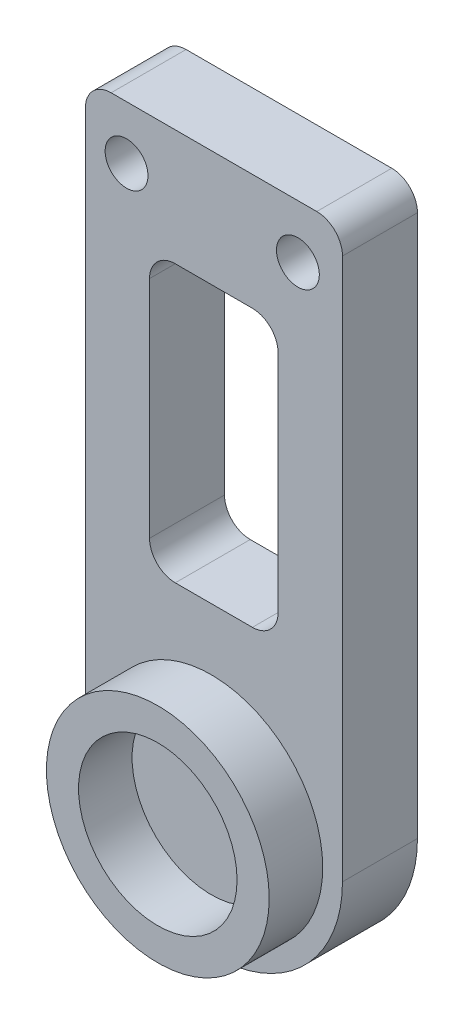
ISO-10303-21;
HEADER;
FILE_DESCRIPTION(('STEP AP214'),'2;1');
FILE_NAME('part.step','',(''),(''),'','','');
FILE_SCHEMA(('AUTOMOTIVE_DESIGN { 1 0 10303 214 1 1 1 1 }'));
ENDSEC;
DATA;
#1=APPLICATION_CONTEXT('core data for automotive mechanical design processes');
#2=APPLICATION_PROTOCOL_DEFINITION('international standard','automotive_design',2000,#1);
#3=PRODUCT_CONTEXT('',#1,'mechanical');
#4=PRODUCT('Part','Part','',(#3));
#5=PRODUCT_RELATED_PRODUCT_CATEGORY('part','',(#4));
#6=PRODUCT_DEFINITION_FORMATION('','',#4);
#7=PRODUCT_DEFINITION_CONTEXT('part definition',#1,'design');
#8=PRODUCT_DEFINITION('design','',#6,#7);
#9=PRODUCT_DEFINITION_SHAPE('','',#8);
#10=(LENGTH_UNIT() NAMED_UNIT(*) SI_UNIT(.MILLI.,.METRE.));
#11=(NAMED_UNIT(*) PLANE_ANGLE_UNIT() SI_UNIT($,.RADIAN.));
#12=(NAMED_UNIT(*) SI_UNIT($,.STERADIAN.) SOLID_ANGLE_UNIT());
#13=UNCERTAINTY_MEASURE_WITH_UNIT(LENGTH_MEASURE(1.E-05),#10,'distance_accuracy_value','');
#14=(GEOMETRIC_REPRESENTATION_CONTEXT(3) GLOBAL_UNCERTAINTY_ASSIGNED_CONTEXT((#13)) GLOBAL_UNIT_ASSIGNED_CONTEXT((#10,
#11,#12)) REPRESENTATION_CONTEXT('',''));
#15=CARTESIAN_POINT('',(0.,0.,0.));
#16=DIRECTION('',(0.,0.,1.));
#17=DIRECTION('',(1.,0.,0.));
#18=AXIS2_PLACEMENT_3D('',#15,#16,#17);
#19=CARTESIAN_POINT('',(0.,0.,13.5));
#20=DIRECTION('',(0.,0.,1.));
#21=DIRECTION('',(1.,0.,0.));
#22=AXIS2_PLACEMENT_3D('',#19,#20,#21);
#23=PLANE('',#22);
#24=CARTESIAN_POINT('',(-277.110164076838,256.963992390388,13.5));
#25=DIRECTION('',(0.,0.,1.));
#26=DIRECTION('',(1.,0.,0.));
#27=AXIS2_PLACEMENT_3D('',#24,#25,#26);
#28=CIRCLE('',#27,5.20000000000003);
#29=CARTESIAN_POINT('',(-271.910164076838,256.963992390388,13.5));
#30=VERTEX_POINT('',#29);
#31=EDGE_CURVE('E276',#30,#30,#28,.T.);
#32=ORIENTED_EDGE('',*,*,#31,.F.);
#33=EDGE_LOOP('',(#32));
#34=FACE_BOUND('',#33,.T.);
#35=CARTESIAN_POINT('',(-281.069234981742,280.854420412727,13.5));
#36=DIRECTION('',(0.,0.,1.));
#37=DIRECTION('',(1.,0.,0.));
#38=AXIS2_PLACEMENT_3D('',#35,#36,#37);
#39=CIRCLE('',#38,1.00000000000005);
#40=CARTESIAN_POINT('',(-280.069234981742,280.854420412727,13.5));
#41=VERTEX_POINT('',#40);
#42=EDGE_CURVE('E319',#41,#41,#39,.T.);
#43=ORIENTED_EDGE('',*,*,#42,.F.);
#44=EDGE_LOOP('',(#43));
#45=FACE_BOUND('',#44,.T.);
#46=DIRECTION('',(0.,-1.,0.));
#47=VECTOR('',#46,1.);
#48=CARTESIAN_POINT('',(-282.988860295457,283.351135253906,13.5));
#49=LINE('',#48,#47);
#50=CARTESIAN_POINT('',(-282.988860295457,282.151135253906,13.5));
#51=VERTEX_POINT('',#50);
#52=CARTESIAN_POINT('',(-282.988860295457,256.851135253906,13.5));
#53=VERTEX_POINT('',#52);
#54=EDGE_CURVE('E327',#51,#53,#49,.T.);
#55=ORIENTED_EDGE('',*,*,#54,.T.);
#56=CARTESIAN_POINT('',(-276.988860295457,256.851135253906,13.5));
#57=DIRECTION('',(0.,0.,1.));
#58=DIRECTION('',(1.,0.,0.));
#59=AXIS2_PLACEMENT_3D('',#56,#57,#58);
#60=CIRCLE('',#59,6.);
#61=CARTESIAN_POINT('',(-276.988860295457,250.851135253906,13.5));
#62=VERTEX_POINT('',#61);
#63=EDGE_CURVE('E60',#53,#62,#60,.T.);
#64=ORIENTED_EDGE('',*,*,#63,.T.);
#65=CARTESIAN_POINT('',(-276.988860295457,256.851135253906,13.5));
#66=DIRECTION('',(0.,0.,1.));
#67=DIRECTION('',(1.,0.,0.));
#68=AXIS2_PLACEMENT_3D('',#65,#66,#67);
#69=CIRCLE('',#68,6.);
#70=CARTESIAN_POINT('',(-270.988860295457,256.851135253906,13.5));
#71=VERTEX_POINT('',#70);
#72=EDGE_CURVE('E55',#62,#71,#69,.T.);
#73=ORIENTED_EDGE('',*,*,#72,.T.);
#74=DIRECTION('',(0.,1.,0.));
#75=VECTOR('',#74,1.);
#76=CARTESIAN_POINT('',(-270.988860295457,283.351135253906,13.5));
#77=LINE('',#76,#75);
#78=CARTESIAN_POINT('',(-270.988860295457,282.151135253906,13.5));
#79=VERTEX_POINT('',#78);
#80=EDGE_CURVE('E181',#71,#79,#77,.T.);
#81=ORIENTED_EDGE('',*,*,#80,.T.);
#82=CARTESIAN_POINT('',(-272.188860295457,282.151135253906,13.5));
#83=DIRECTION('',(0.,0.,1.));
#84=DIRECTION('',(1.,0.,0.));
#85=AXIS2_PLACEMENT_3D('',#82,#83,#84);
#86=CIRCLE('',#85,1.2);
#87=CARTESIAN_POINT('',(-272.188860295457,283.351135253906,13.5));
#88=VERTEX_POINT('',#87);
#89=EDGE_CURVE('E224',#79,#88,#86,.T.);
#90=ORIENTED_EDGE('',*,*,#89,.T.);
#91=DIRECTION('',(-1.,0.,0.));
#92=VECTOR('',#91,1.);
#93=CARTESIAN_POINT('',(-282.988860295457,283.351135253906,13.5));
#94=LINE('',#93,#92);
#95=CARTESIAN_POINT('',(-281.788860295457,283.351135253906,13.5));
#96=VERTEX_POINT('',#95);
#97=EDGE_CURVE('E174',#88,#96,#94,.T.);
#98=ORIENTED_EDGE('',*,*,#97,.T.);
#99=CARTESIAN_POINT('',(-281.788860295457,282.151135253906,13.5));
#100=DIRECTION('',(0.,0.,1.));
#101=DIRECTION('',(1.,0.,0.));
#102=AXIS2_PLACEMENT_3D('',#99,#100,#101);
#103=CIRCLE('',#102,1.2);
#104=EDGE_CURVE('E227',#96,#51,#103,.T.);
#105=ORIENTED_EDGE('',*,*,#104,.T.);
#106=EDGE_LOOP('',(#55,#64,#73,#81,#90,#98,#105));
#107=FACE_BOUND('',#106,.T.);
#108=CARTESIAN_POINT('',(-273.069234981742,280.854420412727,13.5));
#109=DIRECTION('',(0.,0.,1.));
#110=DIRECTION('',(1.,0.,0.));
#111=AXIS2_PLACEMENT_3D('',#108,#109,#110);
#112=CIRCLE('',#111,0.999999999999998);
#113=CARTESIAN_POINT('',(-272.069234981742,280.854420412727,13.5));
#114=VERTEX_POINT('',#113);
#115=EDGE_CURVE('E311',#114,#114,#112,.T.);
#116=ORIENTED_EDGE('',*,*,#115,.F.);
#117=EDGE_LOOP('',(#116));
#118=FACE_BOUND('',#117,.T.);
#119=DIRECTION('',(1.,0.,0.));
#120=VECTOR('',#119,1.);
#121=CARTESIAN_POINT('',(-279.994472891922,265.037209026072,13.5));
#122=LINE('',#121,#120);
#123=CARTESIAN_POINT('',(-278.794472891922,265.037209026072,13.5));
#124=VERTEX_POINT('',#123);
#125=CARTESIAN_POINT('',(-275.194472891922,265.037209026072,13.5));
#126=VERTEX_POINT('',#125);
#127=EDGE_CURVE('E289',#124,#126,#122,.T.);
#128=ORIENTED_EDGE('',*,*,#127,.F.);
#129=CARTESIAN_POINT('',(-278.794472891922,266.237209026072,13.5));
#130=DIRECTION('',(0.,0.,1.));
#131=DIRECTION('',(1.,0.,0.));
#132=AXIS2_PLACEMENT_3D('',#129,#130,#131);
#133=CIRCLE('',#132,1.2);
#134=CARTESIAN_POINT('',(-279.994472891922,266.237209026072,13.5));
#135=VERTEX_POINT('',#134);
#136=EDGE_CURVE('E237',#124,#135,#133,.F.);
#137=ORIENTED_EDGE('',*,*,#136,.T.);
#138=DIRECTION('',(0.,-1.,0.));
#139=VECTOR('',#138,1.);
#140=CARTESIAN_POINT('',(-279.994472891922,277.937209026072,13.5));
#141=LINE('',#140,#139);
#142=CARTESIAN_POINT('',(-279.994472891922,276.737209026072,13.5));
#143=VERTEX_POINT('',#142);
#144=EDGE_CURVE('E286',#143,#135,#141,.T.);
#145=ORIENTED_EDGE('',*,*,#144,.F.);
#146=CARTESIAN_POINT('',(-278.794472891922,276.737209026072,13.5));
#147=DIRECTION('',(0.,0.,1.));
#148=DIRECTION('',(1.,0.,0.));
#149=AXIS2_PLACEMENT_3D('',#146,#147,#148);
#150=CIRCLE('',#149,1.2);
#151=CARTESIAN_POINT('',(-278.794472891922,277.937209026072,13.5));
#152=VERTEX_POINT('',#151);
#153=EDGE_CURVE('E156',#143,#152,#150,.F.);
#154=ORIENTED_EDGE('',*,*,#153,.T.);
#155=DIRECTION('',(-1.,0.,0.));
#156=VECTOR('',#155,1.);
#157=CARTESIAN_POINT('',(-279.994472891922,277.937209026072,13.5));
#158=LINE('',#157,#156);
#159=CARTESIAN_POINT('',(-275.194472891922,277.937209026072,13.5));
#160=VERTEX_POINT('',#159);
#161=EDGE_CURVE('E297',#160,#152,#158,.T.);
#162=ORIENTED_EDGE('',*,*,#161,.F.);
#163=CARTESIAN_POINT('',(-275.194472891922,276.737209026072,13.5));
#164=DIRECTION('',(0.,0.,1.));
#165=DIRECTION('',(1.,0.,0.));
#166=AXIS2_PLACEMENT_3D('',#163,#164,#165);
#167=CIRCLE('',#166,1.2);
#168=CARTESIAN_POINT('',(-273.994472891922,276.737209026072,13.5));
#169=VERTEX_POINT('',#168);
#170=EDGE_CURVE('E157',#160,#169,#167,.F.);
#171=ORIENTED_EDGE('',*,*,#170,.T.);
#172=DIRECTION('',(0.,1.,0.));
#173=VECTOR('',#172,1.);
#174=CARTESIAN_POINT('',(-273.994472891922,277.937209026072,13.5));
#175=LINE('',#174,#173);
#176=CARTESIAN_POINT('',(-273.994472891922,266.237209026072,13.5));
#177=VERTEX_POINT('',#176);
#178=EDGE_CURVE('E293',#177,#169,#175,.T.);
#179=ORIENTED_EDGE('',*,*,#178,.F.);
#180=CARTESIAN_POINT('',(-275.194472891922,266.237209026072,13.5));
#181=DIRECTION('',(0.,0.,1.));
#182=DIRECTION('',(1.,0.,0.));
#183=AXIS2_PLACEMENT_3D('',#180,#181,#182);
#184=CIRCLE('',#183,1.2);
#185=EDGE_CURVE('E243',#177,#126,#184,.F.);
#186=ORIENTED_EDGE('',*,*,#185,.T.);
#187=EDGE_LOOP('',(#128,#137,#145,#154,#162,#171,#179,#186));
#188=FACE_BOUND('',#187,.T.);
#189=ADVANCED_FACE('F39',(#34,#45,#107,#118,#188),#23,.T.);
#190=CARTESIAN_POINT('',(0.,0.,10.));
#191=DIRECTION('',(0.,0.,1.));
#192=DIRECTION('',(1.,0.,0.));
#193=AXIS2_PLACEMENT_3D('',#190,#191,#192);
#194=PLANE('',#193);
#195=CARTESIAN_POINT('',(-273.069234981742,280.854420412727,10.));
#196=DIRECTION('',(0.,0.,1.));
#197=DIRECTION('',(1.,0.,0.));
#198=AXIS2_PLACEMENT_3D('',#195,#196,#197);
#199=CIRCLE('',#198,0.999999999999998);
#200=CARTESIAN_POINT('',(-272.069234981742,280.854420412727,10.));
#201=VERTEX_POINT('',#200);
#202=EDGE_CURVE('E300',#201,#201,#199,.T.);
#203=ORIENTED_EDGE('',*,*,#202,.T.);
#204=EDGE_LOOP('',(#203));
#205=FACE_BOUND('',#204,.T.);
#206=CARTESIAN_POINT('',(-281.069234981742,280.854420412727,10.));
#207=DIRECTION('',(0.,0.,1.));
#208=DIRECTION('',(1.,0.,0.));
#209=AXIS2_PLACEMENT_3D('',#206,#207,#208);
#210=CIRCLE('',#209,1.00000000000005);
#211=CARTESIAN_POINT('',(-280.069234981742,280.854420412727,10.));
#212=VERTEX_POINT('',#211);
#213=EDGE_CURVE('E315',#212,#212,#210,.T.);
#214=ORIENTED_EDGE('',*,*,#213,.T.);
#215=EDGE_LOOP('',(#214));
#216=FACE_BOUND('',#215,.T.);
#217=CARTESIAN_POINT('',(-276.988860295457,256.851135253906,10.));
#218=DIRECTION('',(0.,0.,1.));
#219=DIRECTION('',(1.,0.,0.));
#220=AXIS2_PLACEMENT_3D('',#217,#218,#219);
#221=CIRCLE('',#220,6.);
#222=CARTESIAN_POINT('',(-270.988860295457,256.851135253906,10.));
#223=VERTEX_POINT('',#222);
#224=CARTESIAN_POINT('',(-276.988860295457,250.851135253906,10.));
#225=VERTEX_POINT('',#224);
#226=EDGE_CURVE('E253',#223,#225,#221,.F.);
#227=ORIENTED_EDGE('',*,*,#226,.T.);
#228=CARTESIAN_POINT('',(-276.988860295457,256.851135253906,10.));
#229=DIRECTION('',(0.,0.,1.));
#230=DIRECTION('',(1.,0.,0.));
#231=AXIS2_PLACEMENT_3D('',#228,#229,#230);
#232=CIRCLE('',#231,6.);
#233=CARTESIAN_POINT('',(-282.988860295457,256.851135253906,10.));
#234=VERTEX_POINT('',#233);
#235=EDGE_CURVE('E256',#225,#234,#232,.F.);
#236=ORIENTED_EDGE('',*,*,#235,.T.);
#237=DIRECTION('',(0.,-1.,0.));
#238=VECTOR('',#237,1.);
#239=CARTESIAN_POINT('',(-282.988860295457,283.351135253906,10.));
#240=LINE('',#239,#238);
#241=CARTESIAN_POINT('',(-282.988860295457,282.151135253906,10.));
#242=VERTEX_POINT('',#241);
#243=EDGE_CURVE('E323',#242,#234,#240,.T.);
#244=ORIENTED_EDGE('',*,*,#243,.F.);
#245=CARTESIAN_POINT('',(-281.788860295457,282.151135253906,10.));
#246=DIRECTION('',(0.,0.,1.));
#247=DIRECTION('',(1.,0.,0.));
#248=AXIS2_PLACEMENT_3D('',#245,#246,#247);
#249=CIRCLE('',#248,1.2);
#250=CARTESIAN_POINT('',(-281.788860295457,283.351135253906,10.));
#251=VERTEX_POINT('',#250);
#252=EDGE_CURVE('E214',#242,#251,#249,.F.);
#253=ORIENTED_EDGE('',*,*,#252,.T.);
#254=DIRECTION('',(-1.,0.,0.));
#255=VECTOR('',#254,1.);
#256=CARTESIAN_POINT('',(-282.988860295457,283.351135253906,10.));
#257=LINE('',#256,#255);
#258=CARTESIAN_POINT('',(-272.188860295457,283.351135253906,10.));
#259=VERTEX_POINT('',#258);
#260=EDGE_CURVE('E184',#259,#251,#257,.T.);
#261=ORIENTED_EDGE('',*,*,#260,.F.);
#262=CARTESIAN_POINT('',(-272.188860295457,282.151135253906,10.));
#263=DIRECTION('',(0.,0.,1.));
#264=DIRECTION('',(1.,0.,0.));
#265=AXIS2_PLACEMENT_3D('',#262,#263,#264);
#266=CIRCLE('',#265,1.2);
#267=CARTESIAN_POINT('',(-270.988860295457,282.151135253906,10.));
#268=VERTEX_POINT('',#267);
#269=EDGE_CURVE('E210',#259,#268,#266,.F.);
#270=ORIENTED_EDGE('',*,*,#269,.T.);
#271=DIRECTION('',(0.,1.,0.));
#272=VECTOR('',#271,1.);
#273=CARTESIAN_POINT('',(-270.988860295457,283.351135253906,10.));
#274=LINE('',#273,#272);
#275=EDGE_CURVE('E334',#223,#268,#274,.T.);
#276=ORIENTED_EDGE('',*,*,#275,.F.);
#277=EDGE_LOOP('',(#227,#236,#244,#253,#261,#270,#276));
#278=FACE_BOUND('',#277,.T.);
#279=DIRECTION('',(-1.,0.,0.));
#280=VECTOR('',#279,1.);
#281=CARTESIAN_POINT('',(-279.994472891922,277.937209026072,10.));
#282=LINE('',#281,#280);
#283=CARTESIAN_POINT('',(-275.194472891922,277.937209026072,10.));
#284=VERTEX_POINT('',#283);
#285=CARTESIAN_POINT('',(-278.794472891922,277.937209026072,10.));
#286=VERTEX_POINT('',#285);
#287=EDGE_CURVE('E150',#284,#286,#282,.T.);
#288=ORIENTED_EDGE('',*,*,#287,.T.);
#289=CARTESIAN_POINT('',(-278.794472891922,276.737209026072,10.));
#290=DIRECTION('',(0.,0.,1.));
#291=DIRECTION('',(1.,0.,0.));
#292=AXIS2_PLACEMENT_3D('',#289,#290,#291);
#293=CIRCLE('',#292,1.2);
#294=CARTESIAN_POINT('',(-279.994472891922,276.737209026072,10.));
#295=VERTEX_POINT('',#294);
#296=EDGE_CURVE('E145',#286,#295,#293,.T.);
#297=ORIENTED_EDGE('',*,*,#296,.T.);
#298=DIRECTION('',(0.,-1.,0.));
#299=VECTOR('',#298,1.);
#300=CARTESIAN_POINT('',(-279.994472891922,277.937209026072,10.));
#301=LINE('',#300,#299);
#302=CARTESIAN_POINT('',(-279.994472891922,266.237209026072,10.));
#303=VERTEX_POINT('',#302);
#304=EDGE_CURVE('E148',#295,#303,#301,.T.);
#305=ORIENTED_EDGE('',*,*,#304,.T.);
#306=CARTESIAN_POINT('',(-278.794472891922,266.237209026072,10.));
#307=DIRECTION('',(0.,0.,1.));
#308=DIRECTION('',(1.,0.,0.));
#309=AXIS2_PLACEMENT_3D('',#306,#307,#308);
#310=CIRCLE('',#309,1.2);
#311=CARTESIAN_POINT('',(-278.794472891922,265.037209026072,10.));
#312=VERTEX_POINT('',#311);
#313=EDGE_CURVE('E234',#303,#312,#310,.T.);
#314=ORIENTED_EDGE('',*,*,#313,.T.);
#315=DIRECTION('',(1.,0.,0.));
#316=VECTOR('',#315,1.);
#317=CARTESIAN_POINT('',(-279.994472891922,265.037209026072,10.));
#318=LINE('',#317,#316);
#319=CARTESIAN_POINT('',(-275.194472891922,265.037209026072,10.));
#320=VERTEX_POINT('',#319);
#321=EDGE_CURVE('E168',#312,#320,#318,.T.);
#322=ORIENTED_EDGE('',*,*,#321,.T.);
#323=CARTESIAN_POINT('',(-275.194472891922,266.237209026072,10.));
#324=DIRECTION('',(0.,0.,1.));
#325=DIRECTION('',(1.,0.,0.));
#326=AXIS2_PLACEMENT_3D('',#323,#324,#325);
#327=CIRCLE('',#326,1.2);
#328=CARTESIAN_POINT('',(-273.994472891922,266.237209026072,10.));
#329=VERTEX_POINT('',#328);
#330=EDGE_CURVE('E240',#320,#329,#327,.T.);
#331=ORIENTED_EDGE('',*,*,#330,.T.);
#332=DIRECTION('',(0.,1.,0.));
#333=VECTOR('',#332,1.);
#334=CARTESIAN_POINT('',(-273.994472891922,277.937209026072,10.));
#335=LINE('',#334,#333);
#336=CARTESIAN_POINT('',(-273.994472891922,276.737209026072,10.));
#337=VERTEX_POINT('',#336);
#338=EDGE_CURVE('E305',#329,#337,#335,.T.);
#339=ORIENTED_EDGE('',*,*,#338,.T.);
#340=CARTESIAN_POINT('',(-275.194472891922,276.737209026072,10.));
#341=DIRECTION('',(0.,0.,1.));
#342=DIRECTION('',(1.,0.,0.));
#343=AXIS2_PLACEMENT_3D('',#340,#341,#342);
#344=CIRCLE('',#343,1.2);
#345=EDGE_CURVE('E246',#337,#284,#344,.T.);
#346=ORIENTED_EDGE('',*,*,#345,.T.);
#347=EDGE_LOOP('',(#288,#297,#305,#314,#322,#331,#339,#346));
#348=FACE_BOUND('',#347,.T.);
#349=ADVANCED_FACE('F147',(#205,#216,#278,#348),#194,.F.);
#350=CARTESIAN_POINT('',(-282.988860295457,283.351135253906,13.5));
#351=DIRECTION('',(1.,0.,0.));
#352=DIRECTION('',(0.,0.,-1.));
#353=AXIS2_PLACEMENT_3D('',#350,#351,#352);
#354=PLANE('',#353);
#355=ORIENTED_EDGE('',*,*,#243,.T.);
#356=DIRECTION('',(0.,0.,-1.));
#357=VECTOR('',#356,1.);
#358=CARTESIAN_POINT('',(-282.988860295457,256.851135253906,13.5));
#359=LINE('',#358,#357);
#360=EDGE_CURVE('E259',#234,#53,#359,.F.);
#361=ORIENTED_EDGE('',*,*,#360,.T.);
#362=ORIENTED_EDGE('',*,*,#54,.F.);
#363=DIRECTION('',(0.,0.,-1.));
#364=VECTOR('',#363,1.);
#365=CARTESIAN_POINT('',(-282.988860295457,282.151135253906,13.5));
#366=LINE('',#365,#364);
#367=EDGE_CURVE('E206',#51,#242,#366,.T.);
#368=ORIENTED_EDGE('',*,*,#367,.T.);
#369=EDGE_LOOP('',(#355,#361,#362,#368));
#370=FACE_BOUND('',#369,.T.);
#371=ADVANCED_FACE('F354',(#370),#354,.F.);
#372=CARTESIAN_POINT('',(-270.988860295457,283.351135253906,13.5));
#373=DIRECTION('',(-1.,0.,0.));
#374=DIRECTION('',(0.,0.,1.));
#375=AXIS2_PLACEMENT_3D('',#372,#373,#374);
#376=PLANE('',#375);
#377=ORIENTED_EDGE('',*,*,#80,.F.);
#378=DIRECTION('',(0.,0.,-1.));
#379=VECTOR('',#378,1.);
#380=CARTESIAN_POINT('',(-270.988860295457,256.851135253906,13.5));
#381=LINE('',#380,#379);
#382=EDGE_CURVE('E48',#71,#223,#381,.T.);
#383=ORIENTED_EDGE('',*,*,#382,.T.);
#384=ORIENTED_EDGE('',*,*,#275,.T.);
#385=DIRECTION('',(0.,0.,-1.));
#386=VECTOR('',#385,1.);
#387=CARTESIAN_POINT('',(-270.988860295457,282.151135253906,13.5));
#388=LINE('',#387,#386);
#389=EDGE_CURVE('E230',#268,#79,#388,.F.);
#390=ORIENTED_EDGE('',*,*,#389,.T.);
#391=EDGE_LOOP('',(#377,#383,#384,#390));
#392=FACE_BOUND('',#391,.T.);
#393=ADVANCED_FACE('F361',(#392),#376,.F.);
#394=CARTESIAN_POINT('',(-282.988860295457,283.351135253906,13.5));
#395=DIRECTION('',(0.,-1.,0.));
#396=DIRECTION('',(1.,0.,0.));
#397=AXIS2_PLACEMENT_3D('',#394,#395,#396);
#398=PLANE('',#397);
#399=ORIENTED_EDGE('',*,*,#260,.T.);
#400=DIRECTION('',(0.,0.,-1.));
#401=VECTOR('',#400,1.);
#402=CARTESIAN_POINT('',(-281.788860295457,283.351135253906,13.5));
#403=LINE('',#402,#401);
#404=EDGE_CURVE('E221',#251,#96,#403,.F.);
#405=ORIENTED_EDGE('',*,*,#404,.T.);
#406=ORIENTED_EDGE('',*,*,#97,.F.);
#407=DIRECTION('',(0.,0.,-1.));
#408=VECTOR('',#407,1.);
#409=CARTESIAN_POINT('',(-272.188860295457,283.351135253906,13.5));
#410=LINE('',#409,#408);
#411=EDGE_CURVE('E217',#88,#259,#410,.T.);
#412=ORIENTED_EDGE('',*,*,#411,.T.);
#413=EDGE_LOOP('',(#399,#405,#406,#412));
#414=FACE_BOUND('',#413,.T.);
#415=ADVANCED_FACE('F343',(#414),#398,.F.);
#416=CARTESIAN_POINT('',(-281.069234981742,280.854420412727,13.5));
#417=DIRECTION('',(0.,0.,-1.));
#418=DIRECTION('',(-1.,0.,0.));
#419=AXIS2_PLACEMENT_3D('',#416,#417,#418);
#420=CYLINDRICAL_SURFACE('',#419,1.00000000000005);
#421=ORIENTED_EDGE('',*,*,#42,.T.);
#422=EDGE_LOOP('',(#421));
#423=FACE_BOUND('',#422,.T.);
#424=ORIENTED_EDGE('',*,*,#213,.F.);
#425=EDGE_LOOP('',(#424));
#426=FACE_BOUND('',#425,.T.);
#427=ADVANCED_FACE('F423',(#423,#426),#420,.F.);
#428=CARTESIAN_POINT('',(-273.069234981742,280.854420412727,13.5));
#429=DIRECTION('',(0.,0.,-1.));
#430=DIRECTION('',(-1.,0.,0.));
#431=AXIS2_PLACEMENT_3D('',#428,#429,#430);
#432=CYLINDRICAL_SURFACE('',#431,0.999999999999998);
#433=ORIENTED_EDGE('',*,*,#115,.T.);
#434=EDGE_LOOP('',(#433));
#435=FACE_BOUND('',#434,.T.);
#436=ORIENTED_EDGE('',*,*,#202,.F.);
#437=EDGE_LOOP('',(#436));
#438=FACE_BOUND('',#437,.T.);
#439=ADVANCED_FACE('F421',(#435,#438),#432,.F.);
#440=CARTESIAN_POINT('',(-279.994472891922,277.937209026072,13.5));
#441=DIRECTION('',(1.,0.,0.));
#442=DIRECTION('',(0.,0.,-1.));
#443=AXIS2_PLACEMENT_3D('',#440,#441,#442);
#444=PLANE('',#443);
#445=ORIENTED_EDGE('',*,*,#144,.T.);
#446=DIRECTION('',(0.,0.,-1.));
#447=VECTOR('',#446,1.);
#448=CARTESIAN_POINT('',(-279.994472891922,266.237209026072,10.));
#449=LINE('',#448,#447);
#450=EDGE_CURVE('E166',#135,#303,#449,.T.);
#451=ORIENTED_EDGE('',*,*,#450,.T.);
#452=ORIENTED_EDGE('',*,*,#304,.F.);
#453=DIRECTION('',(0.,0.,-1.));
#454=VECTOR('',#453,1.);
#455=CARTESIAN_POINT('',(-279.994472891922,276.737209026072,13.5));
#456=LINE('',#455,#454);
#457=EDGE_CURVE('E163',#295,#143,#456,.F.);
#458=ORIENTED_EDGE('',*,*,#457,.T.);
#459=EDGE_LOOP('',(#445,#451,#452,#458));
#460=FACE_BOUND('',#459,.T.);
#461=ADVANCED_FACE('F162',(#460),#444,.T.);
#462=CARTESIAN_POINT('',(-279.994472891922,265.037209026072,13.5));
#463=DIRECTION('',(0.,1.,0.));
#464=DIRECTION('',(0.,0.,1.));
#465=AXIS2_PLACEMENT_3D('',#462,#463,#464);
#466=PLANE('',#465);
#467=ORIENTED_EDGE('',*,*,#321,.F.);
#468=DIRECTION('',(0.,0.,-1.));
#469=VECTOR('',#468,1.);
#470=CARTESIAN_POINT('',(-278.794472891922,265.037209026072,13.5));
#471=LINE('',#470,#469);
#472=EDGE_CURVE('E190',#312,#124,#471,.F.);
#473=ORIENTED_EDGE('',*,*,#472,.T.);
#474=ORIENTED_EDGE('',*,*,#127,.T.);
#475=DIRECTION('',(0.,0.,-1.));
#476=VECTOR('',#475,1.);
#477=CARTESIAN_POINT('',(-275.194472891922,265.037209026072,10.));
#478=LINE('',#477,#476);
#479=EDGE_CURVE('E178',#126,#320,#478,.T.);
#480=ORIENTED_EDGE('',*,*,#479,.T.);
#481=EDGE_LOOP('',(#467,#473,#474,#480));
#482=FACE_BOUND('',#481,.T.);
#483=ADVANCED_FACE('F414',(#482),#466,.T.);
#484=CARTESIAN_POINT('',(-273.994472891922,277.937209026072,13.5));
#485=DIRECTION('',(-1.,0.,0.));
#486=DIRECTION('',(0.,0.,1.));
#487=AXIS2_PLACEMENT_3D('',#484,#485,#486);
#488=PLANE('',#487);
#489=ORIENTED_EDGE('',*,*,#338,.F.);
#490=DIRECTION('',(0.,0.,-1.));
#491=VECTOR('',#490,1.);
#492=CARTESIAN_POINT('',(-273.994472891922,266.237209026072,13.5));
#493=LINE('',#492,#491);
#494=EDGE_CURVE('E197',#329,#177,#493,.F.);
#495=ORIENTED_EDGE('',*,*,#494,.T.);
#496=ORIENTED_EDGE('',*,*,#178,.T.);
#497=DIRECTION('',(0.,0.,-1.));
#498=VECTOR('',#497,1.);
#499=CARTESIAN_POINT('',(-273.994472891922,276.737209026072,10.));
#500=LINE('',#499,#498);
#501=EDGE_CURVE('E193',#169,#337,#500,.T.);
#502=ORIENTED_EDGE('',*,*,#501,.T.);
#503=EDGE_LOOP('',(#489,#495,#496,#502));
#504=FACE_BOUND('',#503,.T.);
#505=ADVANCED_FACE('F410',(#504),#488,.T.);
#506=CARTESIAN_POINT('',(-279.994472891922,277.937209026072,13.5));
#507=DIRECTION('',(0.,-1.,0.));
#508=DIRECTION('',(0.,0.,-1.));
#509=AXIS2_PLACEMENT_3D('',#506,#507,#508);
#510=PLANE('',#509);
#511=ORIENTED_EDGE('',*,*,#287,.F.);
#512=DIRECTION('',(0.,0.,-1.));
#513=VECTOR('',#512,1.);
#514=CARTESIAN_POINT('',(-275.194472891922,277.937209026072,13.5));
#515=LINE('',#514,#513);
#516=EDGE_CURVE('E203',#284,#160,#515,.F.);
#517=ORIENTED_EDGE('',*,*,#516,.T.);
#518=ORIENTED_EDGE('',*,*,#161,.T.);
#519=DIRECTION('',(0.,0.,-1.));
#520=VECTOR('',#519,1.);
#521=CARTESIAN_POINT('',(-278.794472891922,277.937209026072,10.));
#522=LINE('',#521,#520);
#523=EDGE_CURVE('E200',#152,#286,#522,.T.);
#524=ORIENTED_EDGE('',*,*,#523,.T.);
#525=EDGE_LOOP('',(#511,#517,#518,#524));
#526=FACE_BOUND('',#525,.T.);
#527=ADVANCED_FACE('F406',(#526),#510,.T.);
#528=CARTESIAN_POINT('',(-278.794472891922,266.237209026072,13.5));
#529=DIRECTION('',(0.,0.,1.));
#530=DIRECTION('',(1.,0.,0.));
#531=AXIS2_PLACEMENT_3D('',#528,#529,#530);
#532=CYLINDRICAL_SURFACE('',#531,1.2);
#533=ORIENTED_EDGE('',*,*,#136,.F.);
#534=ORIENTED_EDGE('',*,*,#472,.F.);
#535=ORIENTED_EDGE('',*,*,#313,.F.);
#536=ORIENTED_EDGE('',*,*,#450,.F.);
#537=EDGE_LOOP('',(#533,#534,#535,#536));
#538=FACE_BOUND('',#537,.T.);
#539=ADVANCED_FACE('F409',(#538),#532,.F.);
#540=CARTESIAN_POINT('',(-275.194472891922,266.237209026072,13.5));
#541=DIRECTION('',(0.,0.,1.));
#542=DIRECTION('',(1.,0.,0.));
#543=AXIS2_PLACEMENT_3D('',#540,#541,#542);
#544=CYLINDRICAL_SURFACE('',#543,1.2);
#545=ORIENTED_EDGE('',*,*,#185,.F.);
#546=ORIENTED_EDGE('',*,*,#494,.F.);
#547=ORIENTED_EDGE('',*,*,#330,.F.);
#548=ORIENTED_EDGE('',*,*,#479,.F.);
#549=EDGE_LOOP('',(#545,#546,#547,#548));
#550=FACE_BOUND('',#549,.T.);
#551=ADVANCED_FACE('F444',(#550),#544,.F.);
#552=CARTESIAN_POINT('',(-275.194472891922,276.737209026072,13.5));
#553=DIRECTION('',(0.,0.,1.));
#554=DIRECTION('',(1.,0.,0.));
#555=AXIS2_PLACEMENT_3D('',#552,#553,#554);
#556=CYLINDRICAL_SURFACE('',#555,1.2);
#557=ORIENTED_EDGE('',*,*,#170,.F.);
#558=ORIENTED_EDGE('',*,*,#516,.F.);
#559=ORIENTED_EDGE('',*,*,#345,.F.);
#560=ORIENTED_EDGE('',*,*,#501,.F.);
#561=EDGE_LOOP('',(#557,#558,#559,#560));
#562=FACE_BOUND('',#561,.T.);
#563=ADVANCED_FACE('F448',(#562),#556,.F.);
#564=CARTESIAN_POINT('',(-278.794472891922,276.737209026072,13.5));
#565=DIRECTION('',(0.,0.,1.));
#566=DIRECTION('',(1.,0.,0.));
#567=AXIS2_PLACEMENT_3D('',#564,#565,#566);
#568=CYLINDRICAL_SURFACE('',#567,1.2);
#569=ORIENTED_EDGE('',*,*,#153,.F.);
#570=ORIENTED_EDGE('',*,*,#457,.F.);
#571=ORIENTED_EDGE('',*,*,#296,.F.);
#572=ORIENTED_EDGE('',*,*,#523,.F.);
#573=EDGE_LOOP('',(#569,#570,#571,#572));
#574=FACE_BOUND('',#573,.T.);
#575=ADVANCED_FACE('F172',(#574),#568,.F.);
#576=CARTESIAN_POINT('',(-281.788860295457,282.151135253906,13.5));
#577=DIRECTION('',(0.,0.,-1.));
#578=DIRECTION('',(-1.,0.,0.));
#579=AXIS2_PLACEMENT_3D('',#576,#577,#578);
#580=CYLINDRICAL_SURFACE('',#579,1.2);
#581=ORIENTED_EDGE('',*,*,#104,.F.);
#582=ORIENTED_EDGE('',*,*,#404,.F.);
#583=ORIENTED_EDGE('',*,*,#252,.F.);
#584=ORIENTED_EDGE('',*,*,#367,.F.);
#585=EDGE_LOOP('',(#581,#582,#583,#584));
#586=FACE_BOUND('',#585,.T.);
#587=ADVANCED_FACE('F349',(#586),#580,.T.);
#588=CARTESIAN_POINT('',(-272.188860295457,282.151135253906,13.5));
#589=DIRECTION('',(0.,0.,-1.));
#590=DIRECTION('',(-1.,0.,0.));
#591=AXIS2_PLACEMENT_3D('',#588,#589,#590);
#592=CYLINDRICAL_SURFACE('',#591,1.2);
#593=ORIENTED_EDGE('',*,*,#89,.F.);
#594=ORIENTED_EDGE('',*,*,#389,.F.);
#595=ORIENTED_EDGE('',*,*,#269,.F.);
#596=ORIENTED_EDGE('',*,*,#411,.F.);
#597=EDGE_LOOP('',(#593,#594,#595,#596));
#598=FACE_BOUND('',#597,.T.);
#599=ADVANCED_FACE('F365',(#598),#592,.T.);
#600=CARTESIAN_POINT('',(-276.988860295457,256.851135253906,13.5));
#601=DIRECTION('',(0.,0.,-1.));
#602=DIRECTION('',(-1.,0.,0.));
#603=AXIS2_PLACEMENT_3D('',#600,#601,#602);
#604=CYLINDRICAL_SURFACE('',#603,6.);
#605=ORIENTED_EDGE('',*,*,#382,.F.);
#606=ORIENTED_EDGE('',*,*,#72,.F.);
#607=DIRECTION('',(0.,0.,-1.));
#608=VECTOR('',#607,1.);
#609=CARTESIAN_POINT('',(-276.988860295457,250.851135253906,13.5));
#610=LINE('',#609,#608);
#611=EDGE_CURVE('E169',#225,#62,#610,.F.);
#612=ORIENTED_EDGE('',*,*,#611,.F.);
#613=ORIENTED_EDGE('',*,*,#226,.F.);
#614=EDGE_LOOP('',(#605,#606,#612,#613));
#615=FACE_BOUND('',#614,.T.);
#616=ADVANCED_FACE('F41',(#615),#604,.T.);
#617=CARTESIAN_POINT('',(-276.988860295457,256.851135253906,13.5));
#618=DIRECTION('',(0.,0.,-1.));
#619=DIRECTION('',(-1.,0.,0.));
#620=AXIS2_PLACEMENT_3D('',#617,#618,#619);
#621=CYLINDRICAL_SURFACE('',#620,6.);
#622=ORIENTED_EDGE('',*,*,#63,.F.);
#623=ORIENTED_EDGE('',*,*,#360,.F.);
#624=ORIENTED_EDGE('',*,*,#235,.F.);
#625=ORIENTED_EDGE('',*,*,#611,.T.);
#626=EDGE_LOOP('',(#622,#623,#624,#625));
#627=FACE_BOUND('',#626,.T.);
#628=ADVANCED_FACE('F357',(#627),#621,.T.);
#629=CARTESIAN_POINT('',(-277.110164076838,256.963992390388,16.));
#630=DIRECTION('',(0.,0.,1.));
#631=DIRECTION('',(1.,0.,0.));
#632=AXIS2_PLACEMENT_3D('',#629,#630,#631);
#633=PLANE('',#632);
#634=CARTESIAN_POINT('',(-277.110164076838,256.963992390388,16.));
#635=DIRECTION('',(0.,0.,1.));
#636=DIRECTION('',(1.,0.,0.));
#637=AXIS2_PLACEMENT_3D('',#634,#635,#636);
#638=CIRCLE('',#637,5.20000000000003);
#639=CARTESIAN_POINT('',(-271.910164076838,256.963992390388,16.));
#640=VERTEX_POINT('',#639);
#641=EDGE_CURVE('E270',#640,#640,#638,.T.);
#642=ORIENTED_EDGE('',*,*,#641,.T.);
#643=EDGE_LOOP('',(#642));
#644=FACE_BOUND('',#643,.T.);
#645=CARTESIAN_POINT('',(-277.110164076838,256.963992390388,16.));
#646=DIRECTION('',(0.,0.,1.));
#647=DIRECTION('',(1.,0.,0.));
#648=AXIS2_PLACEMENT_3D('',#645,#646,#647);
#649=CIRCLE('',#648,3.7);
#650=CARTESIAN_POINT('',(-273.410164076838,256.963992390388,16.));
#651=VERTEX_POINT('',#650);
#652=EDGE_CURVE('E282',#651,#651,#649,.T.);
#653=ORIENTED_EDGE('',*,*,#652,.F.);
#654=EDGE_LOOP('',(#653));
#655=FACE_BOUND('',#654,.T.);
#656=ADVANCED_FACE('F399',(#644,#655),#633,.T.);
#657=CARTESIAN_POINT('',(-277.110164076838,256.963992390388,16.));
#658=DIRECTION('',(0.,0.,-1.));
#659=DIRECTION('',(-1.,0.,0.));
#660=AXIS2_PLACEMENT_3D('',#657,#658,#659);
#661=CYLINDRICAL_SURFACE('',#660,5.20000000000003);
#662=ORIENTED_EDGE('',*,*,#641,.F.);
#663=EDGE_LOOP('',(#662));
#664=FACE_BOUND('',#663,.T.);
#665=ORIENTED_EDGE('',*,*,#31,.T.);
#666=EDGE_LOOP('',(#665));
#667=FACE_BOUND('',#666,.T.);
#668=ADVANCED_FACE('F391',(#664,#667),#661,.T.);
#669=CARTESIAN_POINT('',(-277.110164076838,256.963992390388,16.));
#670=DIRECTION('',(0.,0.,-1.));
#671=DIRECTION('',(-1.,0.,0.));
#672=AXIS2_PLACEMENT_3D('',#669,#670,#671);
#673=CYLINDRICAL_SURFACE('',#672,3.7);
#674=ORIENTED_EDGE('',*,*,#652,.T.);
#675=EDGE_LOOP('',(#674));
#676=FACE_BOUND('',#675,.T.);
#677=CARTESIAN_POINT('',(-277.110164076838,256.963992390388,13.5));
#678=DIRECTION('',(0.,0.,1.));
#679=DIRECTION('',(1.,0.,0.));
#680=AXIS2_PLACEMENT_3D('',#677,#678,#679);
#681=CIRCLE('',#680,3.7);
#682=CARTESIAN_POINT('',(-273.410164076838,256.963992390388,13.5));
#683=VERTEX_POINT('',#682);
#684=EDGE_CURVE('E11',#683,#683,#681,.F.);
#685=ORIENTED_EDGE('',*,*,#684,.T.);
#686=EDGE_LOOP('',(#685));
#687=FACE_BOUND('',#686,.T.);
#688=ADVANCED_FACE('F386',(#676,#687),#673,.F.);
#689=ORIENTED_EDGE('',*,*,#684,.F.);
#690=EDGE_LOOP('',(#689));
#691=FACE_BOUND('',#690,.T.);
#692=ADVANCED_FACE('F376',(#691),#23,.T.);
#693=CLOSED_SHELL('',(#189,#349,#371,#393,#415,#427,#439,#461,#483,#505,#527,#539,#551,#563,
#575,#587,#599,#616,#628,#656,#668,#688,#692));
#694=MANIFOLD_SOLID_BREP('B2',#693);
#695=ADVANCED_BREP_SHAPE_REPRESENTATION('',(#18,#694),#14);
#696=SHAPE_DEFINITION_REPRESENTATION(#9,#695);
ENDSEC;
END-ISO-10303-21;
